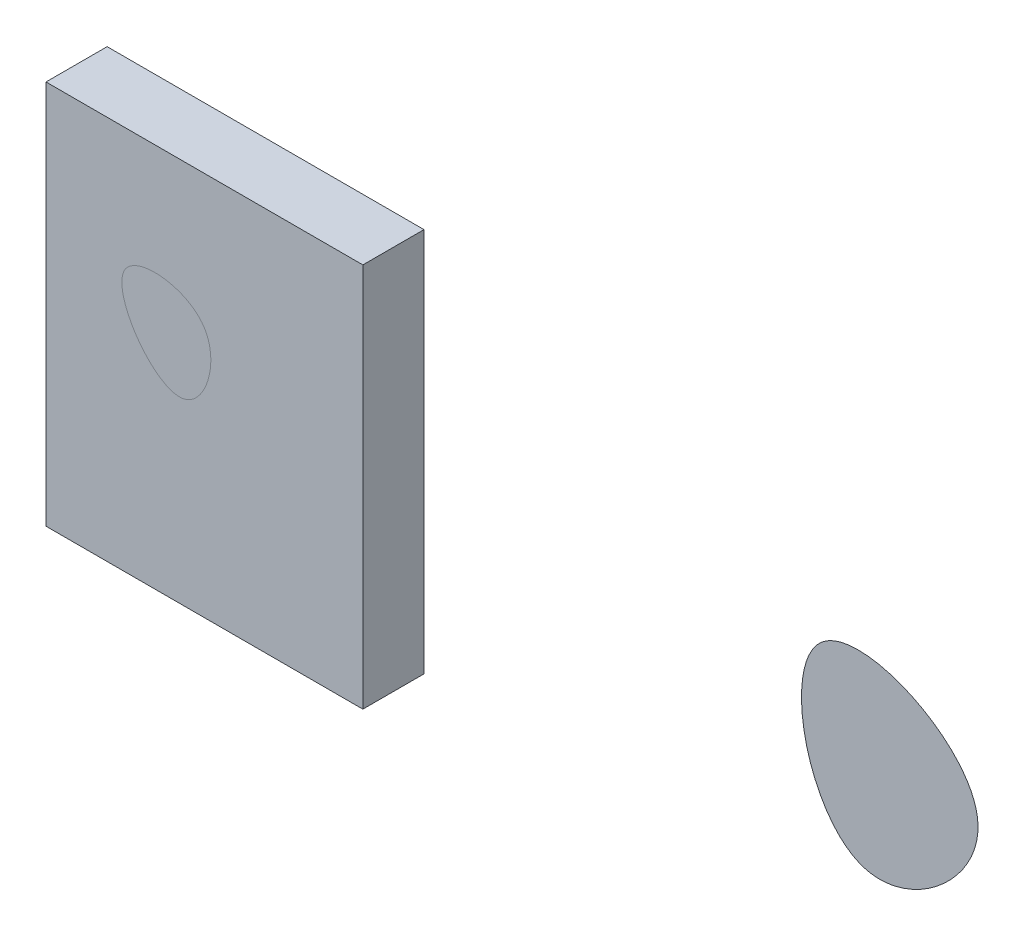
ISO-10303-21;
HEADER;
FILE_DESCRIPTION(('STEP AP214'),'2;1');
FILE_NAME('part.step','',(''),(''),'','','');
FILE_SCHEMA(('AUTOMOTIVE_DESIGN { 1 0 10303 214 1 1 1 1 }'));
ENDSEC;
DATA;
#1=APPLICATION_CONTEXT('core data for automotive mechanical design processes');
#2=APPLICATION_PROTOCOL_DEFINITION('international standard','automotive_design',2000,#1);
#3=PRODUCT_CONTEXT('',#1,'mechanical');
#4=PRODUCT('Part','Part','',(#3));
#5=PRODUCT_RELATED_PRODUCT_CATEGORY('part','',(#4));
#6=PRODUCT_DEFINITION_FORMATION('','',#4);
#7=PRODUCT_DEFINITION_CONTEXT('part definition',#1,'design');
#8=PRODUCT_DEFINITION('design','',#6,#7);
#9=PRODUCT_DEFINITION_SHAPE('','',#8);
#10=(LENGTH_UNIT() NAMED_UNIT(*) SI_UNIT(.MILLI.,.METRE.));
#11=(NAMED_UNIT(*) PLANE_ANGLE_UNIT() SI_UNIT($,.RADIAN.));
#12=(NAMED_UNIT(*) SI_UNIT($,.STERADIAN.) SOLID_ANGLE_UNIT());
#13=UNCERTAINTY_MEASURE_WITH_UNIT(LENGTH_MEASURE(1.E-05),#10,'distance_accuracy_value','');
#14=(GEOMETRIC_REPRESENTATION_CONTEXT(3) GLOBAL_UNCERTAINTY_ASSIGNED_CONTEXT((#13)) GLOBAL_UNIT_ASSIGNED_CONTEXT((#10,
#11,#12)) REPRESENTATION_CONTEXT('',''));
#15=CARTESIAN_POINT('',(0.,0.,0.));
#16=DIRECTION('',(0.,0.,1.));
#17=DIRECTION('',(1.,0.,0.));
#18=AXIS2_PLACEMENT_3D('',#15,#16,#17);
#19=CARTESIAN_POINT('',(-39.2354755414191,-0.0179482109824344,-10.));
#20=DIRECTION('',(0.,0.,-1.));
#21=DIRECTION('',(-1.,0.,0.));
#22=AXIS2_PLACEMENT_3D('',#19,#20,#21);
#23=PLANE('',#22);
#24=CARTESIAN_POINT('',(-51.9900133722344,10.7991125699003,-10.));
#25=CARTESIAN_POINT('',(-54.6044060913013,6.72458409520125,-10.));
#26=CARTESIAN_POINT('',(-41.9614235246001,-11.5388275765151,-10.));
#27=CARTESIAN_POINT('',(-34.0583393558281,12.4705141494168,-10.));
#28=CARTESIAN_POINT('',(-49.9292276805776,14.0108450382745,-10.));
#29=CARTESIAN_POINT('',(-51.9900133722344,10.7991125699003,-10.));
#30=B_SPLINE_CURVE_WITH_KNOTS('',3,(#24,#25,#26,#27,#28,#29),.UNSPECIFIED.,.T.,.F.,(4,1,1,4),
(0.,0.396316013873514,0.687605322334089,1.),.UNSPECIFIED.);
#31=CARTESIAN_POINT('',(-51.9900133722344,10.7991125699003,-10.));
#32=VERTEX_POINT('',#31);
#33=EDGE_CURVE('E11',#32,#32,#30,.T.);
#34=ORIENTED_EDGE('',*,*,#33,.F.);
#35=EDGE_LOOP('',(#34));
#36=FACE_BOUND('',#35,.T.);
#37=ADVANCED_FACE('F44',(#36),#23,.T.);
#38=OPEN_SHELL('',(#37));
#39=SHELL_BASED_SURFACE_MODEL('B2',(#38));
#40=CARTESIAN_POINT('',(-39.2354755414191,-0.0179482109824344,0.));
#41=DIRECTION('',(0.,0.,-1.));
#42=DIRECTION('',(-1.,0.,0.));
#43=AXIS2_PLACEMENT_3D('',#40,#41,#42);
#44=PLANE('',#43);
#45=CARTESIAN_POINT('',(-51.9900133722344,10.7991125699003,0.));
#46=CARTESIAN_POINT('',(-54.6044060913013,6.72458409520125,0.));
#47=CARTESIAN_POINT('',(-41.9614235246001,-11.5388275765151,0.));
#48=CARTESIAN_POINT('',(-34.0583393558281,12.4705141494168,0.));
#49=CARTESIAN_POINT('',(-49.9292276805776,14.0108450382745,0.));
#50=CARTESIAN_POINT('',(-51.9900133722344,10.7991125699003,0.));
#51=B_SPLINE_CURVE_WITH_KNOTS('',3,(#45,#46,#47,#48,#49,#50),.UNSPECIFIED.,.T.,.F.,(4,1,1,4),
(0.,0.396316013873514,0.687605322334089,1.),.UNSPECIFIED.);
#52=CARTESIAN_POINT('',(-51.9900133722344,10.7991125699003,0.));
#53=VERTEX_POINT('',#52);
#54=EDGE_CURVE('E43',#53,#53,#51,.T.);
#55=ORIENTED_EDGE('',*,*,#54,.T.);
#56=EDGE_LOOP('',(#55));
#57=FACE_BOUND('',#56,.T.);
#58=ADVANCED_FACE('F76',(#57),#44,.F.);
#59=OPEN_SHELL('',(#58));
#60=SHELL_BASED_SURFACE_MODEL('B6',(#59));
#61=CARTESIAN_POINT('',(-13.1132081205932,30.8546073425723,0.));
#62=DIRECTION('',(1.,0.,0.));
#63=DIRECTION('',(0.,1.,0.));
#64=AXIS2_PLACEMENT_3D('',#61,#62,#63);
#65=PLANE('',#64);
#66=DIRECTION('',(0.,0.,1.));
#67=VECTOR('',#66,1.);
#68=CARTESIAN_POINT('',(-13.1132081205932,-32.0887916362752,0.));
#69=LINE('',#68,#67);
#70=CARTESIAN_POINT('',(-13.1132081205932,-32.0887916362752,-10.));
#71=VERTEX_POINT('',#70);
#72=CARTESIAN_POINT('',(-13.1132081205932,-32.0887916362752,0.));
#73=VERTEX_POINT('',#72);
#74=EDGE_CURVE('E74',#71,#73,#69,.T.);
#75=ORIENTED_EDGE('',*,*,#74,.F.);
#76=DIRECTION('',(0.,1.,0.));
#77=VECTOR('',#76,1.);
#78=CARTESIAN_POINT('',(-13.1132081205932,0.,-10.));
#79=LINE('',#78,#77);
#80=CARTESIAN_POINT('',(-13.1132081205932,30.8546073425723,-10.));
#81=VERTEX_POINT('',#80);
#82=EDGE_CURVE('E159',#71,#81,#79,.T.);
#83=ORIENTED_EDGE('',*,*,#82,.T.);
#84=DIRECTION('',(0.,0.,1.));
#85=VECTOR('',#84,1.);
#86=CARTESIAN_POINT('',(-13.1132081205932,30.8546073425723,0.));
#87=LINE('',#86,#85);
#88=CARTESIAN_POINT('',(-13.1132081205932,30.8546073425723,0.));
#89=VERTEX_POINT('',#88);
#90=EDGE_CURVE('E115',#81,#89,#87,.T.);
#91=ORIENTED_EDGE('',*,*,#90,.T.);
#92=DIRECTION('',(0.,1.,0.));
#93=VECTOR('',#92,1.);
#94=CARTESIAN_POINT('',(-13.1132081205932,30.8546073425723,0.));
#95=LINE('',#94,#93);
#96=EDGE_CURVE('E176',#73,#89,#95,.T.);
#97=ORIENTED_EDGE('',*,*,#96,.F.);
#98=EDGE_LOOP('',(#75,#83,#91,#97));
#99=FACE_BOUND('',#98,.T.);
#100=ADVANCED_FACE('F105',(#99),#65,.T.);
#101=CARTESIAN_POINT('',(-64.9489484561148,30.8546073425723,0.));
#102=DIRECTION('',(0.,1.,0.));
#103=DIRECTION('',(-1.,0.,0.));
#104=AXIS2_PLACEMENT_3D('',#101,#102,#103);
#105=PLANE('',#104);
#106=ORIENTED_EDGE('',*,*,#90,.F.);
#107=DIRECTION('',(1.,0.,0.));
#108=VECTOR('',#107,1.);
#109=CARTESIAN_POINT('',(0.,30.8546073425723,-10.));
#110=LINE('',#109,#108);
#111=CARTESIAN_POINT('',(-64.9489484561148,30.8546073425723,-10.));
#112=VERTEX_POINT('',#111);
#113=EDGE_CURVE('E170',#81,#112,#110,.F.);
#114=ORIENTED_EDGE('',*,*,#113,.T.);
#115=DIRECTION('',(0.,0.,1.));
#116=VECTOR('',#115,1.);
#117=CARTESIAN_POINT('',(-64.9489484561148,30.8546073425723,0.));
#118=LINE('',#117,#116);
#119=CARTESIAN_POINT('',(-64.9489484561148,30.8546073425723,0.));
#120=VERTEX_POINT('',#119);
#121=EDGE_CURVE('E123',#112,#120,#118,.T.);
#122=ORIENTED_EDGE('',*,*,#121,.T.);
#123=DIRECTION('',(-1.,0.,0.));
#124=VECTOR('',#123,1.);
#125=CARTESIAN_POINT('',(-64.9489484561148,30.8546073425723,0.));
#126=LINE('',#125,#124);
#127=EDGE_CURVE('E153',#89,#120,#126,.T.);
#128=ORIENTED_EDGE('',*,*,#127,.F.);
#129=EDGE_LOOP('',(#106,#114,#122,#128));
#130=FACE_BOUND('',#129,.T.);
#131=ADVANCED_FACE('F181',(#130),#105,.T.);
#132=CARTESIAN_POINT('',(-64.9489484561148,30.8546073425723,0.));
#133=DIRECTION('',(-1.,0.,0.));
#134=DIRECTION('',(0.,-1.,0.));
#135=AXIS2_PLACEMENT_3D('',#132,#133,#134);
#136=PLANE('',#135);
#137=ORIENTED_EDGE('',*,*,#121,.F.);
#138=DIRECTION('',(0.,1.,0.));
#139=VECTOR('',#138,1.);
#140=CARTESIAN_POINT('',(-64.9489484561148,0.,-10.));
#141=LINE('',#140,#139);
#142=CARTESIAN_POINT('',(-64.9489484561148,-32.0887916362752,-10.));
#143=VERTEX_POINT('',#142);
#144=EDGE_CURVE('E158',#112,#143,#141,.F.);
#145=ORIENTED_EDGE('',*,*,#144,.T.);
#146=DIRECTION('',(0.,0.,1.));
#147=VECTOR('',#146,1.);
#148=CARTESIAN_POINT('',(-64.9489484561148,-32.0887916362752,0.));
#149=LINE('',#148,#147);
#150=CARTESIAN_POINT('',(-64.9489484561148,-32.0887916362752,0.));
#151=VERTEX_POINT('',#150);
#152=EDGE_CURVE('E109',#143,#151,#149,.T.);
#153=ORIENTED_EDGE('',*,*,#152,.T.);
#154=DIRECTION('',(0.,-1.,0.));
#155=VECTOR('',#154,1.);
#156=CARTESIAN_POINT('',(-64.9489484561148,30.8546073425723,0.));
#157=LINE('',#156,#155);
#158=EDGE_CURVE('E184',#120,#151,#157,.T.);
#159=ORIENTED_EDGE('',*,*,#158,.F.);
#160=EDGE_LOOP('',(#137,#145,#153,#159));
#161=FACE_BOUND('',#160,.T.);
#162=ADVANCED_FACE('F161',(#161),#136,.T.);
#163=CARTESIAN_POINT('',(-51.9900133722344,10.7991125699003,0.));
#164=CARTESIAN_POINT('',(-54.6044060913013,6.72458409520125,0.));
#165=CARTESIAN_POINT('',(-41.9614235246001,-11.5388275765151,0.));
#166=CARTESIAN_POINT('',(-34.0583393558281,12.4705141494168,0.));
#167=CARTESIAN_POINT('',(-49.9292276805776,14.0108450382745,0.));
#168=CARTESIAN_POINT('',(-51.9900133722344,10.7991125699003,0.));
#169=B_SPLINE_CURVE_WITH_KNOTS('',3,(#163,#164,#165,#166,#167,#168),.UNSPECIFIED.,.T.,.F.,(4,1,
1,4),(0.,0.396316013873514,0.687605322334089,1.),.UNSPECIFIED.);
#170=DIRECTION('',(0.,0.,1.));
#171=VECTOR('',#170,1.);
#172=SURFACE_OF_LINEAR_EXTRUSION('',#169,#171);
#173=CARTESIAN_POINT('',(-51.9900133722344,10.7991125699003,0.));
#174=VERTEX_POINT('',#173);
#175=EDGE_CURVE('E172',#174,#174,#169,.T.);
#176=ORIENTED_EDGE('',*,*,#175,.T.);
#177=EDGE_LOOP('',(#176));
#178=FACE_BOUND('',#177,.T.);
#179=CARTESIAN_POINT('',(-51.9900133722344,10.7991125699003,-10.));
#180=CARTESIAN_POINT('',(-54.6044060913013,6.72458409520125,-10.));
#181=CARTESIAN_POINT('',(-41.9614235246001,-11.5388275765151,-10.));
#182=CARTESIAN_POINT('',(-34.0583393558281,12.4705141494168,-10.));
#183=CARTESIAN_POINT('',(-49.9292276805776,14.0108450382745,-10.));
#184=CARTESIAN_POINT('',(-51.9900133722344,10.7991125699003,-10.));
#185=B_SPLINE_CURVE_WITH_KNOTS('',3,(#179,#180,#181,#182,#183,#184),.UNSPECIFIED.,.T.,.F.,(4,1,
1,4),(0.,0.396316013873514,0.687605322334089,1.),.UNSPECIFIED.);
#186=CARTESIAN_POINT('',(-51.9900133722344,10.7991125699003,-10.));
#187=VERTEX_POINT('',#186);
#188=EDGE_CURVE('E162',#187,#187,#185,.T.);
#189=ORIENTED_EDGE('',*,*,#188,.F.);
#190=EDGE_LOOP('',(#189));
#191=FACE_BOUND('',#190,.T.);
#192=ADVANCED_FACE('F194',(#178,#191),#172,.F.);
#193=CARTESIAN_POINT('',(-64.9489484561148,-32.0887916362752,0.));
#194=DIRECTION('',(0.,-1.,0.));
#195=DIRECTION('',(1.,0.,0.));
#196=AXIS2_PLACEMENT_3D('',#193,#194,#195);
#197=PLANE('',#196);
#198=DIRECTION('',(1.,0.,0.));
#199=VECTOR('',#198,1.);
#200=CARTESIAN_POINT('',(0.,-32.0887916362752,-10.));
#201=LINE('',#200,#199);
#202=EDGE_CURVE('E147',#143,#71,#201,.T.);
#203=ORIENTED_EDGE('',*,*,#202,.T.);
#204=ORIENTED_EDGE('',*,*,#74,.T.);
#205=DIRECTION('',(1.,0.,0.));
#206=VECTOR('',#205,1.);
#207=CARTESIAN_POINT('',(-64.9489484561148,-32.0887916362752,0.));
#208=LINE('',#207,#206);
#209=EDGE_CURVE('E149',#151,#73,#208,.T.);
#210=ORIENTED_EDGE('',*,*,#209,.F.);
#211=ORIENTED_EDGE('',*,*,#152,.F.);
#212=EDGE_LOOP('',(#203,#204,#210,#211));
#213=FACE_BOUND('',#212,.T.);
#214=ADVANCED_FACE('F107',(#213),#197,.T.);
#215=CARTESIAN_POINT('',(0.,0.,0.));
#216=DIRECTION('',(0.,0.,1.));
#217=DIRECTION('',(1.,0.,0.));
#218=AXIS2_PLACEMENT_3D('',#215,#216,#217);
#219=PLANE('',#218);
#220=ORIENTED_EDGE('',*,*,#175,.F.);
#221=EDGE_LOOP('',(#220));
#222=FACE_BOUND('',#221,.T.);
#223=ORIENTED_EDGE('',*,*,#158,.T.);
#224=ORIENTED_EDGE('',*,*,#209,.T.);
#225=ORIENTED_EDGE('',*,*,#96,.T.);
#226=ORIENTED_EDGE('',*,*,#127,.T.);
#227=EDGE_LOOP('',(#223,#224,#225,#226));
#228=FACE_BOUND('',#227,.T.);
#229=ADVANCED_FACE('F179',(#222,#228),#219,.T.);
#230=CARTESIAN_POINT('',(0.,0.,-10.));
#231=DIRECTION('',(0.,0.,1.));
#232=DIRECTION('',(1.,0.,0.));
#233=AXIS2_PLACEMENT_3D('',#230,#231,#232);
#234=PLANE('',#233);
#235=ORIENTED_EDGE('',*,*,#188,.T.);
#236=EDGE_LOOP('',(#235));
#237=FACE_BOUND('',#236,.T.);
#238=ORIENTED_EDGE('',*,*,#144,.F.);
#239=ORIENTED_EDGE('',*,*,#113,.F.);
#240=ORIENTED_EDGE('',*,*,#82,.F.);
#241=ORIENTED_EDGE('',*,*,#202,.F.);
#242=EDGE_LOOP('',(#238,#239,#240,#241));
#243=FACE_BOUND('',#242,.T.);
#244=ADVANCED_FACE('F156',(#237,#243),#234,.F.);
#245=CLOSED_SHELL('',(#100,#131,#162,#192,#214,#229,#244));
#246=MANIFOLD_SOLID_BREP('B38',#245);
#247=CARTESIAN_POINT('',(80.9539535847802,-10.0843216007174,0.));
#248=DIRECTION('',(0.,0.,1.));
#249=DIRECTION('',(1.,0.,0.));
#250=AXIS2_PLACEMENT_3D('',#247,#248,#249);
#251=PLANE('',#250);
#252=CARTESIAN_POINT('',(62.1720337952832,15.1187575978605,0.));
#253=CARTESIAN_POINT('',(55.0376372120154,9.51503155915517,0.));
#254=CARTESIAN_POINT('',(63.0782619063658,-27.6851904935883,0.));
#255=CARTESIAN_POINT('',(101.581645088255,5.25535913157544,0.));
#256=CARTESIAN_POINT('',(69.0161815556011,20.4945071191567,0.));
#257=CARTESIAN_POINT('',(62.1720337952832,15.1187575978605,0.));
#258=B_SPLINE_CURVE_WITH_KNOTS('',3,(#252,#253,#254,#255,#256,#257),.UNSPECIFIED.,.T.,.F.,(4,1,
1,4),(0.,0.358406711506224,0.656174357115058,1.),.UNSPECIFIED.);
#259=CARTESIAN_POINT('',(62.1720337952832,15.1187575978605,0.));
#260=VERTEX_POINT('',#259);
#261=EDGE_CURVE('E104',#260,#260,#258,.T.);
#262=ORIENTED_EDGE('',*,*,#261,.T.);
#263=EDGE_LOOP('',(#262));
#264=FACE_BOUND('',#263,.T.);
#265=ADVANCED_FACE('F261',(#264),#251,.T.);
#266=OPEN_SHELL('',(#265));
#267=SHELL_BASED_SURFACE_MODEL('B68',(#266));
#268=ADVANCED_BREP_SHAPE_REPRESENTATION('',(#18,#246),#14);
#269=MANIFOLD_SURFACE_SHAPE_REPRESENTATION('',(#18,#39,#60,#267),#14);
#270=SHAPE_REPRESENTATION('',(#18),#14);
#271=SHAPE_DEFINITION_REPRESENTATION(#9,#270);
#272=SHAPE_REPRESENTATION_RELATIONSHIP('','',#270,#268);
#273=SHAPE_REPRESENTATION_RELATIONSHIP('','',#270,#269);
ENDSEC;
END-ISO-10303-21;
